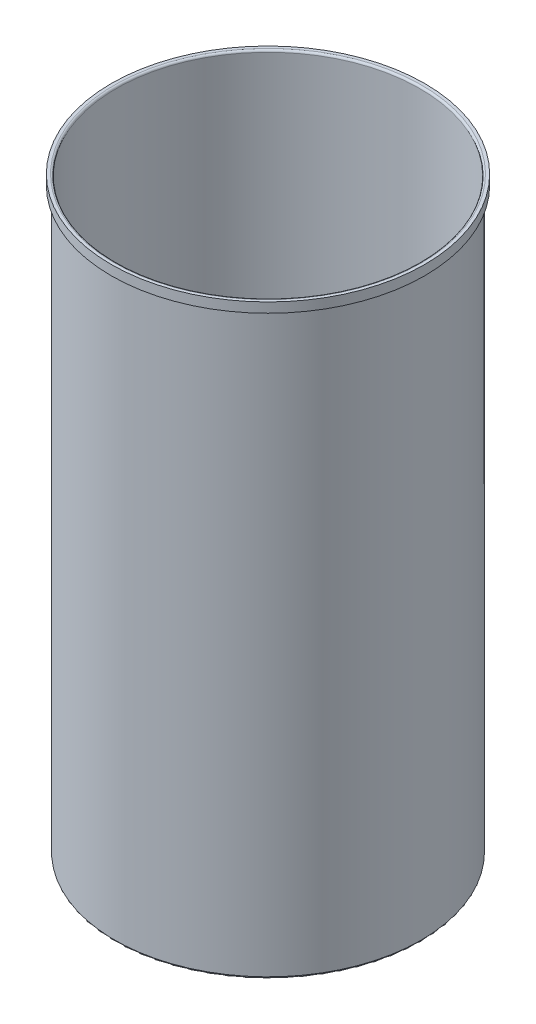
ISO-10303-21;
HEADER;
FILE_DESCRIPTION(('STEP AP214'),'2;1');
FILE_NAME('part.step','',(''),(''),'','','');
FILE_SCHEMA(('AUTOMOTIVE_DESIGN { 1 0 10303 214 1 1 1 1 }'));
ENDSEC;
DATA;
#1=APPLICATION_CONTEXT('core data for automotive mechanical design processes');
#2=APPLICATION_PROTOCOL_DEFINITION('international standard','automotive_design',2000,#1);
#3=PRODUCT_CONTEXT('',#1,'mechanical');
#4=PRODUCT('Part','Part','',(#3));
#5=PRODUCT_RELATED_PRODUCT_CATEGORY('part','',(#4));
#6=PRODUCT_DEFINITION_FORMATION('','',#4);
#7=PRODUCT_DEFINITION_CONTEXT('part definition',#1,'design');
#8=PRODUCT_DEFINITION('design','',#6,#7);
#9=PRODUCT_DEFINITION_SHAPE('','',#8);
#10=(LENGTH_UNIT() NAMED_UNIT(*) SI_UNIT(.MILLI.,.METRE.));
#11=(NAMED_UNIT(*) PLANE_ANGLE_UNIT() SI_UNIT($,.RADIAN.));
#12=(NAMED_UNIT(*) SI_UNIT($,.STERADIAN.) SOLID_ANGLE_UNIT());
#13=UNCERTAINTY_MEASURE_WITH_UNIT(LENGTH_MEASURE(1.E-05),#10,'distance_accuracy_value','');
#14=(GEOMETRIC_REPRESENTATION_CONTEXT(3) GLOBAL_UNCERTAINTY_ASSIGNED_CONTEXT((#13)) GLOBAL_UNIT_ASSIGNED_CONTEXT((#10,
#11,#12)) REPRESENTATION_CONTEXT('',''));
#15=CARTESIAN_POINT('',(0.,0.,0.));
#16=DIRECTION('',(0.,0.,1.));
#17=DIRECTION('',(1.,0.,0.));
#18=AXIS2_PLACEMENT_3D('',#15,#16,#17);
#19=CARTESIAN_POINT('',(0.,0.,0.));
#20=DIRECTION('',(0.,1.,0.));
#21=DIRECTION('',(0.,0.,1.));
#22=AXIS2_PLACEMENT_3D('',#19,#20,#21);
#23=CYLINDRICAL_SURFACE('',#22,198.4375);
#24=DIRECTION('',(0.,1.,0.));
#25=VECTOR('',#24,1.);
#26=CARTESIAN_POINT('',(198.4375,0.,0.));
#27=LINE('',#26,#25);
#28=CARTESIAN_POINT('',(198.4375,0.9525,0.));
#29=VERTEX_POINT('',#28);
#30=CARTESIAN_POINT('',(198.4375,760.4125,0.));
#31=VERTEX_POINT('',#30);
#32=EDGE_CURVE('E230',#29,#31,#27,.T.);
#33=ORIENTED_EDGE('',*,*,#32,.F.);
#34=CARTESIAN_POINT('',(0.,0.9525,0.));
#35=DIRECTION('',(0.,-1.,0.));
#36=DIRECTION('',(0.,0.,-1.));
#37=AXIS2_PLACEMENT_3D('',#34,#35,#36);
#38=CIRCLE('',#37,198.4375);
#39=EDGE_CURVE('E11',#29,#29,#38,.F.);
#40=ORIENTED_EDGE('',*,*,#39,.T.);
#41=ORIENTED_EDGE('',*,*,#32,.T.);
#42=CARTESIAN_POINT('',(0.,760.4125,0.));
#43=DIRECTION('',(0.,1.,0.));
#44=DIRECTION('',(1.,0.,0.));
#45=AXIS2_PLACEMENT_3D('',#42,#43,#44);
#46=CIRCLE('',#45,198.4375);
#47=EDGE_CURVE('E88',#31,#31,#46,.T.);
#48=ORIENTED_EDGE('',*,*,#47,.F.);
#49=EDGE_LOOP('',(#33,#40,#41,#48));
#50=FACE_BOUND('',#49,.T.);
#51=ADVANCED_FACE('F39',(#50),#23,.T.);
#52=CARTESIAN_POINT('',(198.4375,760.4125,0.));
#53=DIRECTION('',(0.,1.,0.));
#54=DIRECTION('',(0.,0.,1.));
#55=AXIS2_PLACEMENT_3D('',#52,#53,#54);
#56=PLANE('',#55);
#57=ORIENTED_EDGE('',*,*,#47,.T.);
#58=EDGE_LOOP('',(#57));
#59=FACE_BOUND('',#58,.T.);
#60=CARTESIAN_POINT('',(0.,760.4125,0.));
#61=DIRECTION('',(0.,1.,0.));
#62=DIRECTION('',(1.,0.,0.));
#63=AXIS2_PLACEMENT_3D('',#60,#61,#62);
#64=CIRCLE('',#63,201.6125);
#65=CARTESIAN_POINT('',(201.6125,760.4125,0.));
#66=VERTEX_POINT('',#65);
#67=EDGE_CURVE('E224',#66,#66,#64,.T.);
#68=ORIENTED_EDGE('',*,*,#67,.F.);
#69=EDGE_LOOP('',(#68));
#70=FACE_BOUND('',#69,.T.);
#71=ADVANCED_FACE('F111',(#59,#70),#56,.F.);
#72=CARTESIAN_POINT('',(0.,0.,0.));
#73=DIRECTION('',(0.,1.,0.));
#74=DIRECTION('',(0.,0.,1.));
#75=AXIS2_PLACEMENT_3D('',#72,#73,#74);
#76=CYLINDRICAL_SURFACE('',#75,201.6125);
#77=DIRECTION('',(0.,-1.,0.));
#78=VECTOR('',#77,1.);
#79=CARTESIAN_POINT('',(201.6125,760.4125,0.));
#80=LINE('',#79,#78);
#81=CARTESIAN_POINT('',(201.6125,749.3,0.));
#82=VERTEX_POINT('',#81);
#83=EDGE_CURVE('E221',#66,#82,#80,.T.);
#84=ORIENTED_EDGE('',*,*,#83,.T.);
#85=CARTESIAN_POINT('',(0.,749.3,0.));
#86=DIRECTION('',(0.,1.,0.));
#87=DIRECTION('',(1.,0.,0.));
#88=AXIS2_PLACEMENT_3D('',#85,#86,#87);
#89=CIRCLE('',#88,201.6125);
#90=EDGE_CURVE('E215',#82,#82,#89,.T.);
#91=ORIENTED_EDGE('',*,*,#90,.F.);
#92=ORIENTED_EDGE('',*,*,#83,.F.);
#93=ORIENTED_EDGE('',*,*,#67,.T.);
#94=EDGE_LOOP('',(#84,#91,#92,#93));
#95=FACE_BOUND('',#94,.T.);
#96=ADVANCED_FACE('F119',(#95),#76,.F.);
#97=CARTESIAN_POINT('',(201.6125,749.3,0.));
#98=DIRECTION('',(0.,1.,0.));
#99=DIRECTION('',(0.,0.,1.));
#100=AXIS2_PLACEMENT_3D('',#97,#98,#99);
#101=PLANE('',#100);
#102=ORIENTED_EDGE('',*,*,#90,.T.);
#103=EDGE_LOOP('',(#102));
#104=FACE_BOUND('',#103,.T.);
#105=CARTESIAN_POINT('',(0.,749.3,0.));
#106=DIRECTION('',(0.,1.,0.));
#107=DIRECTION('',(1.,0.,0.));
#108=AXIS2_PLACEMENT_3D('',#105,#106,#107);
#109=CIRCLE('',#108,203.2);
#110=CARTESIAN_POINT('',(203.2,749.3,0.));
#111=VERTEX_POINT('',#110);
#112=EDGE_CURVE('E213',#111,#111,#109,.T.);
#113=ORIENTED_EDGE('',*,*,#112,.F.);
#114=EDGE_LOOP('',(#113));
#115=FACE_BOUND('',#114,.T.);
#116=ADVANCED_FACE('F129',(#104,#115),#101,.F.);
#117=CARTESIAN_POINT('',(0.,0.,0.));
#118=DIRECTION('',(0.,1.,0.));
#119=DIRECTION('',(0.,0.,1.));
#120=AXIS2_PLACEMENT_3D('',#117,#118,#119);
#121=CYLINDRICAL_SURFACE('',#120,203.2);
#122=DIRECTION('',(0.,1.,0.));
#123=VECTOR('',#122,1.);
#124=CARTESIAN_POINT('',(203.2,749.3,0.));
#125=LINE('',#124,#123);
#126=CARTESIAN_POINT('',(203.2,762.,0.));
#127=VERTEX_POINT('',#126);
#128=EDGE_CURVE('E91',#111,#127,#125,.T.);
#129=ORIENTED_EDGE('',*,*,#128,.T.);
#130=CARTESIAN_POINT('',(0.,762.,0.));
#131=DIRECTION('',(0.,1.,0.));
#132=DIRECTION('',(1.,0.,0.));
#133=AXIS2_PLACEMENT_3D('',#130,#131,#132);
#134=CIRCLE('',#133,203.2);
#135=EDGE_CURVE('E97',#127,#127,#134,.T.);
#136=ORIENTED_EDGE('',*,*,#135,.F.);
#137=ORIENTED_EDGE('',*,*,#128,.F.);
#138=ORIENTED_EDGE('',*,*,#112,.T.);
#139=EDGE_LOOP('',(#129,#136,#137,#138));
#140=FACE_BOUND('',#139,.T.);
#141=ADVANCED_FACE('F133',(#140),#121,.T.);
#142=CARTESIAN_POINT('',(203.2,762.,0.));
#143=DIRECTION('',(0.,-1.,0.));
#144=DIRECTION('',(0.,0.,-1.));
#145=AXIS2_PLACEMENT_3D('',#142,#143,#144);
#146=PLANE('',#145);
#147=ORIENTED_EDGE('',*,*,#135,.T.);
#148=EDGE_LOOP('',(#147));
#149=FACE_BOUND('',#148,.T.);
#150=CARTESIAN_POINT('',(0.,762.,0.));
#151=DIRECTION('',(0.,-1.,0.));
#152=DIRECTION('',(0.,0.,-1.));
#153=AXIS2_PLACEMENT_3D('',#150,#151,#152);
#154=CIRCLE('',#153,199.39);
#155=CARTESIAN_POINT('',(199.39,762.,0.));
#156=VERTEX_POINT('',#155);
#157=EDGE_CURVE('E96',#156,#156,#154,.T.);
#158=ORIENTED_EDGE('',*,*,#157,.T.);
#159=EDGE_LOOP('',(#158));
#160=FACE_BOUND('',#159,.T.);
#161=ADVANCED_FACE('F137',(#149,#160),#146,.F.);
#162=CARTESIAN_POINT('',(0.,0.,0.));
#163=DIRECTION('',(0.,1.,0.));
#164=DIRECTION('',(0.,0.,1.));
#165=AXIS2_PLACEMENT_3D('',#162,#163,#164);
#166=CYLINDRICAL_SURFACE('',#165,196.85);
#167=DIRECTION('',(0.,-1.,0.));
#168=VECTOR('',#167,1.);
#169=CARTESIAN_POINT('',(196.85,0.,0.));
#170=LINE('',#169,#168);
#171=CARTESIAN_POINT('',(196.85,759.46,0.));
#172=VERTEX_POINT('',#171);
#173=CARTESIAN_POINT('',(196.85,0.,0.));
#174=VERTEX_POINT('',#173);
#175=EDGE_CURVE('E81',#172,#174,#170,.T.);
#176=ORIENTED_EDGE('',*,*,#175,.F.);
#177=CARTESIAN_POINT('',(0.,759.46,0.));
#178=DIRECTION('',(0.,-1.,0.));
#179=DIRECTION('',(0.,0.,-1.));
#180=AXIS2_PLACEMENT_3D('',#177,#178,#179);
#181=CIRCLE('',#180,196.85);
#182=EDGE_CURVE('E85',#172,#172,#181,.F.);
#183=ORIENTED_EDGE('',*,*,#182,.T.);
#184=ORIENTED_EDGE('',*,*,#175,.T.);
#185=CARTESIAN_POINT('',(0.,0.,0.));
#186=DIRECTION('',(0.,1.,0.));
#187=DIRECTION('',(1.,0.,0.));
#188=AXIS2_PLACEMENT_3D('',#185,#186,#187);
#189=CIRCLE('',#188,196.85);
#190=EDGE_CURVE('E84',#174,#174,#189,.T.);
#191=ORIENTED_EDGE('',*,*,#190,.F.);
#192=EDGE_LOOP('',(#176,#183,#184,#191));
#193=FACE_BOUND('',#192,.T.);
#194=ADVANCED_FACE('F82',(#193),#166,.F.);
#195=CARTESIAN_POINT('',(0.,0.,0.));
#196=DIRECTION('',(0.,-1.,0.));
#197=DIRECTION('',(0.,0.,-1.));
#198=AXIS2_PLACEMENT_3D('',#195,#196,#197);
#199=PLANE('',#198);
#200=ORIENTED_EDGE('',*,*,#190,.T.);
#201=EDGE_LOOP('',(#200));
#202=FACE_BOUND('',#201,.T.);
#203=ADVANCED_FACE('F124',(#202),#199,.F.);
#204=CARTESIAN_POINT('',(0.,-1.5875,0.));
#205=DIRECTION('',(0.,-1.,0.));
#206=DIRECTION('',(0.,0.,-1.));
#207=AXIS2_PLACEMENT_3D('',#204,#205,#206);
#208=PLANE('',#207);
#209=CARTESIAN_POINT('',(0.,-1.5875,0.));
#210=DIRECTION('',(0.,-1.,0.));
#211=DIRECTION('',(0.,0.,-1.));
#212=AXIS2_PLACEMENT_3D('',#209,#210,#211);
#213=CIRCLE('',#212,195.8975);
#214=CARTESIAN_POINT('',(0.,-1.5875,-195.8975));
#215=VERTEX_POINT('',#214);
#216=EDGE_CURVE('E48',#215,#215,#213,.T.);
#217=ORIENTED_EDGE('',*,*,#216,.T.);
#218=EDGE_LOOP('',(#217));
#219=FACE_BOUND('',#218,.T.);
#220=ADVANCED_FACE('F103',(#219),#208,.T.);
#221=CARTESIAN_POINT('',(0.,759.46,0.));
#222=DIRECTION('',(0.,-1.,0.));
#223=DIRECTION('',(0.,0.,-1.));
#224=AXIS2_PLACEMENT_3D('',#221,#222,#223);
#225=TOROIDAL_SURFACE('',#224,199.39,2.54);
#226=CARTESIAN_POINT('',(199.39,759.46,0.));
#227=DIRECTION('',(0.,0.,1.));
#228=DIRECTION('',(1.,0.,0.));
#229=AXIS2_PLACEMENT_3D('',#226,#227,#228);
#230=CIRCLE('',#229,2.54);
#231=EDGE_CURVE('E43',#156,#172,#230,.T.);
#232=ORIENTED_EDGE('',*,*,#231,.F.);
#233=ORIENTED_EDGE('',*,*,#157,.F.);
#234=ORIENTED_EDGE('',*,*,#231,.T.);
#235=ORIENTED_EDGE('',*,*,#182,.F.);
#236=EDGE_LOOP('',(#232,#233,#234,#235));
#237=FACE_BOUND('',#236,.T.);
#238=ADVANCED_FACE('F106',(#237),#225,.T.);
#239=CARTESIAN_POINT('',(0.,0.9525,0.));
#240=DIRECTION('',(0.,-1.,0.));
#241=DIRECTION('',(0.,0.,-1.));
#242=AXIS2_PLACEMENT_3D('',#239,#240,#241);
#243=TOROIDAL_SURFACE('',#242,195.8975,2.54);
#244=ORIENTED_EDGE('',*,*,#39,.F.);
#245=EDGE_LOOP('',(#244));
#246=FACE_BOUND('',#245,.T.);
#247=ORIENTED_EDGE('',*,*,#216,.F.);
#248=EDGE_LOOP('',(#247));
#249=FACE_BOUND('',#248,.T.);
#250=ADVANCED_FACE('F41',(#246,#249),#243,.T.);
#251=CLOSED_SHELL('',(#51,#71,#96,#116,#141,#161,#194,#203,#220,#238,#250));
#252=MANIFOLD_SOLID_BREP('B2',#251);
#253=ADVANCED_BREP_SHAPE_REPRESENTATION('',(#18,#252),#14);
#254=SHAPE_DEFINITION_REPRESENTATION(#9,#253);
ENDSEC;
END-ISO-10303-21;
